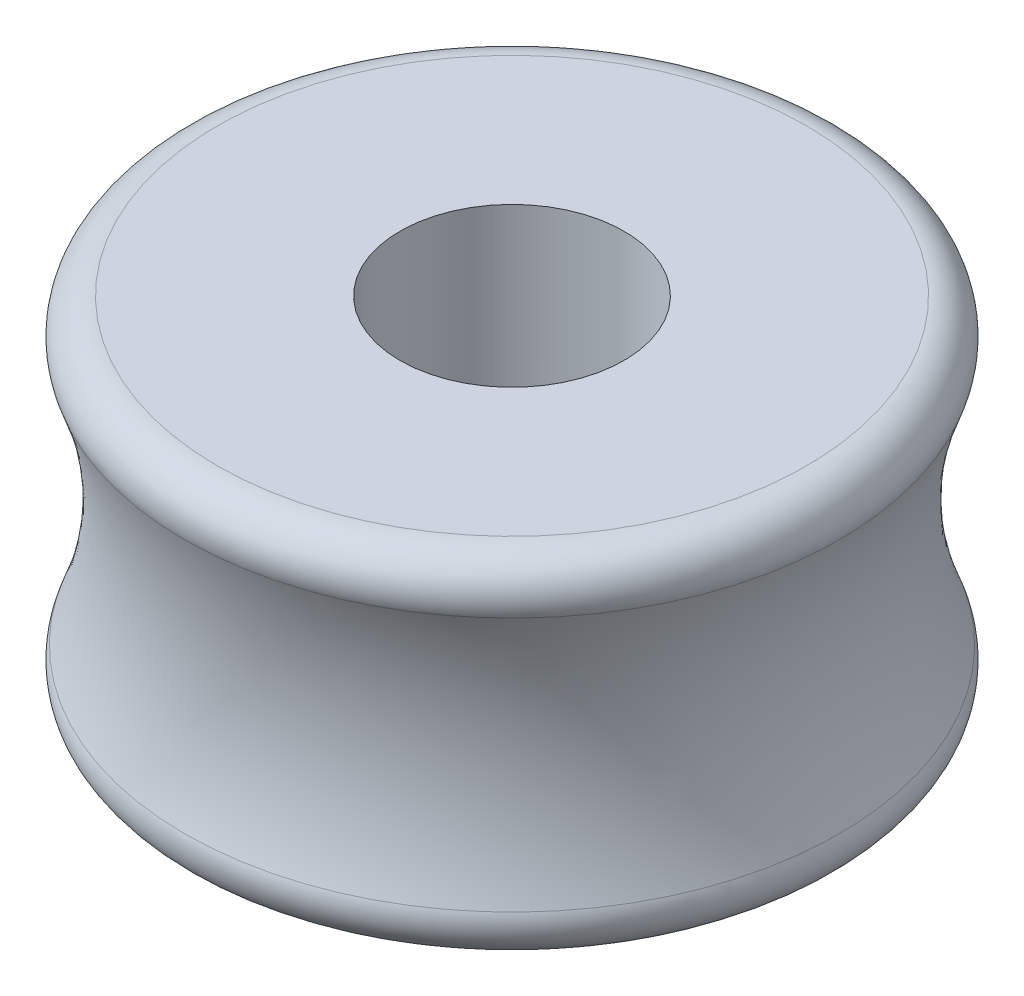
ISO-10303-21;
HEADER;
FILE_DESCRIPTION(('STEP AP214'),'2;1');
FILE_NAME('part.step','',(''),(''),'','','');
FILE_SCHEMA(('AUTOMOTIVE_DESIGN { 1 0 10303 214 1 1 1 1 }'));
ENDSEC;
DATA;
#1=APPLICATION_CONTEXT('core data for automotive mechanical design processes');
#2=APPLICATION_PROTOCOL_DEFINITION('international standard','automotive_design',2000,#1);
#3=PRODUCT_CONTEXT('',#1,'mechanical');
#4=PRODUCT('Part','Part','',(#3));
#5=PRODUCT_RELATED_PRODUCT_CATEGORY('part','',(#4));
#6=PRODUCT_DEFINITION_FORMATION('','',#4);
#7=PRODUCT_DEFINITION_CONTEXT('part definition',#1,'design');
#8=PRODUCT_DEFINITION('design','',#6,#7);
#9=PRODUCT_DEFINITION_SHAPE('','',#8);
#10=(LENGTH_UNIT() NAMED_UNIT(*) SI_UNIT(.MILLI.,.METRE.));
#11=(NAMED_UNIT(*) PLANE_ANGLE_UNIT() SI_UNIT($,.RADIAN.));
#12=(NAMED_UNIT(*) SI_UNIT($,.STERADIAN.) SOLID_ANGLE_UNIT());
#13=UNCERTAINTY_MEASURE_WITH_UNIT(LENGTH_MEASURE(1.E-05),#10,'distance_accuracy_value','');
#14=(GEOMETRIC_REPRESENTATION_CONTEXT(3) GLOBAL_UNCERTAINTY_ASSIGNED_CONTEXT((#13)) GLOBAL_UNIT_ASSIGNED_CONTEXT((#10,
#11,#12)) REPRESENTATION_CONTEXT('',''));
#15=CARTESIAN_POINT('',(0.,0.,0.));
#16=DIRECTION('',(0.,0.,1.));
#17=DIRECTION('',(1.,0.,0.));
#18=AXIS2_PLACEMENT_3D('',#15,#16,#17);
#19=CARTESIAN_POINT('',(0.,0.,0.));
#20=DIRECTION('',(0.,1.,0.));
#21=DIRECTION('',(0.,0.,1.));
#22=AXIS2_PLACEMENT_3D('',#19,#20,#21);
#23=CYLINDRICAL_SURFACE('',#22,1.6);
#24=CARTESIAN_POINT('',(0.,-4.84,0.));
#25=DIRECTION('',(0.,-1.,0.));
#26=DIRECTION('',(0.,0.,-1.));
#27=AXIS2_PLACEMENT_3D('',#24,#25,#26);
#28=CIRCLE('',#27,1.6);
#29=CARTESIAN_POINT('',(0.,-4.84,-1.6));
#30=VERTEX_POINT('',#29);
#31=EDGE_CURVE('E10',#30,#30,#28,.T.);
#32=ORIENTED_EDGE('',*,*,#31,.T.);
#33=EDGE_LOOP('',(#32));
#34=FACE_BOUND('',#33,.T.);
#35=CARTESIAN_POINT('',(0.,0.,0.));
#36=DIRECTION('',(0.,1.,0.));
#37=DIRECTION('',(0.,0.,1.));
#38=AXIS2_PLACEMENT_3D('',#35,#36,#37);
#39=CIRCLE('',#38,1.6);
#40=CARTESIAN_POINT('',(0.,0.,1.6));
#41=VERTEX_POINT('',#40);
#42=EDGE_CURVE('E65',#41,#41,#39,.T.);
#43=ORIENTED_EDGE('',*,*,#42,.T.);
#44=EDGE_LOOP('',(#43));
#45=FACE_BOUND('',#44,.T.);
#46=ADVANCED_FACE('F49',(#34,#45),#23,.F.);
#47=CARTESIAN_POINT('',(-4.2066516359424,0.,0.));
#48=DIRECTION('',(0.,1.,0.));
#49=DIRECTION('',(0.,0.,1.));
#50=AXIS2_PLACEMENT_3D('',#47,#48,#49);
#51=PLANE('',#50);
#52=CARTESIAN_POINT('',(0.,0.,0.));
#53=DIRECTION('',(0.,1.,0.));
#54=DIRECTION('',(0.,0.,1.));
#55=AXIS2_PLACEMENT_3D('',#52,#53,#54);
#56=CIRCLE('',#55,4.2066516359424);
#57=CARTESIAN_POINT('',(0.,0.,4.2066516359424));
#58=VERTEX_POINT('',#57);
#59=EDGE_CURVE('E71',#58,#58,#56,.T.);
#60=ORIENTED_EDGE('',*,*,#59,.T.);
#61=EDGE_LOOP('',(#60));
#62=FACE_BOUND('',#61,.T.);
#63=ORIENTED_EDGE('',*,*,#42,.F.);
#64=EDGE_LOOP('',(#63));
#65=FACE_BOUND('',#64,.T.);
#66=ADVANCED_FACE('F100',(#62,#65),#51,.T.);
#67=CARTESIAN_POINT('',(0.,-0.5,0.));
#68=DIRECTION('',(0.,1.,0.));
#69=DIRECTION('',(0.,0.,1.));
#70=AXIS2_PLACEMENT_3D('',#67,#68,#69);
#71=TOROIDAL_SURFACE('',#70,4.2066516359424,0.500000000000001);
#72=CARTESIAN_POINT('',(0.,-0.681818181818182,0.));
#73=DIRECTION('',(0.,1.,0.));
#74=DIRECTION('',(0.,0.,1.));
#75=AXIS2_PLACEMENT_3D('',#72,#73,#74);
#76=CIRCLE('',#75,4.6724221253042);
#77=CARTESIAN_POINT('',(0.,-0.681818181818182,4.6724221253042));
#78=VERTEX_POINT('',#77);
#79=EDGE_CURVE('E76',#78,#78,#76,.T.);
#80=ORIENTED_EDGE('',*,*,#79,.T.);
#81=EDGE_LOOP('',(#80));
#82=FACE_BOUND('',#81,.T.);
#83=ORIENTED_EDGE('',*,*,#59,.F.);
#84=EDGE_LOOP('',(#83));
#85=FACE_BOUND('',#84,.T.);
#86=ADVANCED_FACE('F103',(#82,#85),#71,.T.);
#87=CARTESIAN_POINT('',(0.,-2.5,0.));
#88=DIRECTION('',(0.,1.,0.));
#89=DIRECTION('',(0.,0.,1.));
#90=AXIS2_PLACEMENT_3D('',#87,#88,#89);
#91=TOROIDAL_SURFACE('',#90,9.33012701892219,5.);
#92=CARTESIAN_POINT('',(0.,-4.31818181818182,0.));
#93=DIRECTION('',(0.,1.,0.));
#94=DIRECTION('',(0.,0.,1.));
#95=AXIS2_PLACEMENT_3D('',#92,#93,#94);
#96=CIRCLE('',#95,4.6724221253042);
#97=CARTESIAN_POINT('',(0.,-4.31818181818182,4.6724221253042));
#98=VERTEX_POINT('',#97);
#99=EDGE_CURVE('E80',#98,#98,#96,.T.);
#100=ORIENTED_EDGE('',*,*,#99,.T.);
#101=EDGE_LOOP('',(#100));
#102=FACE_BOUND('',#101,.T.);
#103=ORIENTED_EDGE('',*,*,#79,.F.);
#104=EDGE_LOOP('',(#103));
#105=FACE_BOUND('',#104,.T.);
#106=ADVANCED_FACE('F97',(#102,#105),#91,.F.);
#107=CARTESIAN_POINT('',(0.,-4.5,0.));
#108=DIRECTION('',(0.,1.,0.));
#109=DIRECTION('',(0.,0.,1.));
#110=AXIS2_PLACEMENT_3D('',#107,#108,#109);
#111=TOROIDAL_SURFACE('',#110,4.2066516359424,0.5);
#112=CARTESIAN_POINT('',(0.,-5.,0.));
#113=DIRECTION('',(0.,1.,0.));
#114=DIRECTION('',(0.,0.,1.));
#115=AXIS2_PLACEMENT_3D('',#112,#113,#114);
#116=CIRCLE('',#115,4.2066516359424);
#117=CARTESIAN_POINT('',(0.,-5.,4.2066516359424));
#118=VERTEX_POINT('',#117);
#119=EDGE_CURVE('E83',#118,#118,#116,.T.);
#120=ORIENTED_EDGE('',*,*,#119,.T.);
#121=EDGE_LOOP('',(#120));
#122=FACE_BOUND('',#121,.T.);
#123=ORIENTED_EDGE('',*,*,#99,.F.);
#124=EDGE_LOOP('',(#123));
#125=FACE_BOUND('',#124,.T.);
#126=ADVANCED_FACE('F87',(#122,#125),#111,.T.);
#127=CARTESIAN_POINT('',(-1.6,-5.,0.));
#128=DIRECTION('',(0.,-1.,0.));
#129=DIRECTION('',(0.,0.,-1.));
#130=AXIS2_PLACEMENT_3D('',#127,#128,#129);
#131=PLANE('',#130);
#132=CARTESIAN_POINT('',(0.,-5.,0.));
#133=DIRECTION('',(0.,-1.,0.));
#134=DIRECTION('',(0.,0.,-1.));
#135=AXIS2_PLACEMENT_3D('',#132,#133,#134);
#136=CIRCLE('',#135,1.76);
#137=CARTESIAN_POINT('',(0.,-5.,-1.76));
#138=VERTEX_POINT('',#137);
#139=EDGE_CURVE('E58',#138,#138,#136,.F.);
#140=ORIENTED_EDGE('',*,*,#139,.T.);
#141=EDGE_LOOP('',(#140));
#142=FACE_BOUND('',#141,.T.);
#143=ORIENTED_EDGE('',*,*,#119,.F.);
#144=EDGE_LOOP('',(#143));
#145=FACE_BOUND('',#144,.T.);
#146=ADVANCED_FACE('F90',(#142,#145),#131,.T.);
#147=CARTESIAN_POINT('',(0.,-5.,0.));
#148=DIRECTION('',(0.,-1.,0.));
#149=DIRECTION('',(0.,0.,-1.));
#150=AXIS2_PLACEMENT_3D('',#147,#148,#149);
#151=CONICAL_SURFACE('',#150,1.76,0.785398163397444);
#152=ORIENTED_EDGE('',*,*,#31,.F.);
#153=EDGE_LOOP('',(#152));
#154=FACE_BOUND('',#153,.T.);
#155=ORIENTED_EDGE('',*,*,#139,.F.);
#156=EDGE_LOOP('',(#155));
#157=FACE_BOUND('',#156,.T.);
#158=ADVANCED_FACE('F52',(#154,#157),#151,.F.);
#159=CLOSED_SHELL('',(#46,#66,#86,#106,#126,#146,#158));
#160=MANIFOLD_SOLID_BREP('B2',#159);
#161=ADVANCED_BREP_SHAPE_REPRESENTATION('',(#18,#160),#14);
#162=SHAPE_DEFINITION_REPRESENTATION(#9,#161);
ENDSEC;
END-ISO-10303-21;
